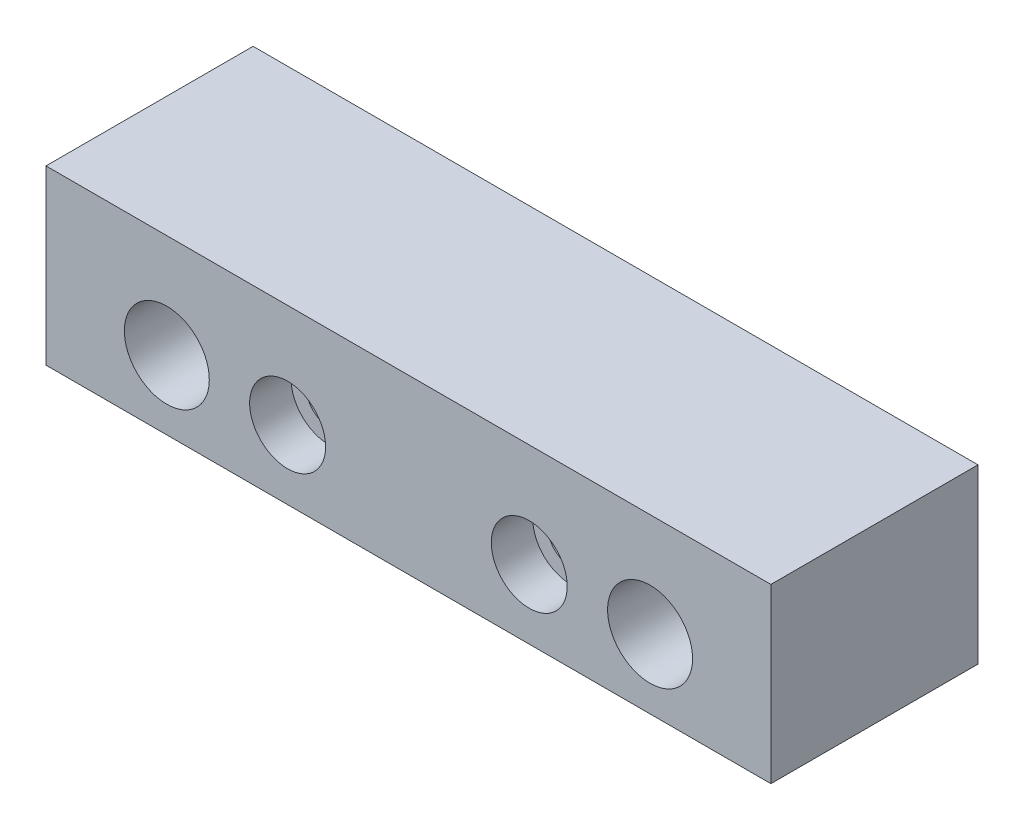
ISO-10303-21;
HEADER;
FILE_DESCRIPTION(('STEP AP214'),'2;1');
FILE_NAME('part.step','',(''),(''),'','','');
FILE_SCHEMA(('AUTOMOTIVE_DESIGN { 1 0 10303 214 1 1 1 1 }'));
ENDSEC;
DATA;
#1=APPLICATION_CONTEXT('core data for automotive mechanical design processes');
#2=APPLICATION_PROTOCOL_DEFINITION('international standard','automotive_design',2000,#1);
#3=PRODUCT_CONTEXT('',#1,'mechanical');
#4=PRODUCT('Part','Part','',(#3));
#5=PRODUCT_RELATED_PRODUCT_CATEGORY('part','',(#4));
#6=PRODUCT_DEFINITION_FORMATION('','',#4);
#7=PRODUCT_DEFINITION_CONTEXT('part definition',#1,'design');
#8=PRODUCT_DEFINITION('design','',#6,#7);
#9=PRODUCT_DEFINITION_SHAPE('','',#8);
#10=(LENGTH_UNIT() NAMED_UNIT(*) SI_UNIT(.MILLI.,.METRE.));
#11=(NAMED_UNIT(*) PLANE_ANGLE_UNIT() SI_UNIT($,.RADIAN.));
#12=(NAMED_UNIT(*) SI_UNIT($,.STERADIAN.) SOLID_ANGLE_UNIT());
#13=UNCERTAINTY_MEASURE_WITH_UNIT(LENGTH_MEASURE(1.E-05),#10,'distance_accuracy_value','');
#14=(GEOMETRIC_REPRESENTATION_CONTEXT(3) GLOBAL_UNCERTAINTY_ASSIGNED_CONTEXT((#13)) GLOBAL_UNIT_ASSIGNED_CONTEXT((#10,
#11,#12)) REPRESENTATION_CONTEXT('',''));
#15=CARTESIAN_POINT('',(0.,0.,0.));
#16=DIRECTION('',(0.,0.,1.));
#17=DIRECTION('',(1.,0.,0.));
#18=AXIS2_PLACEMENT_3D('',#15,#16,#17);
#19=CARTESIAN_POINT('',(-52.5,-12.5,30.));
#20=DIRECTION('',(1.,0.,0.));
#21=DIRECTION('',(0.,0.,-1.));
#22=AXIS2_PLACEMENT_3D('',#19,#20,#21);
#23=PLANE('',#22);
#24=DIRECTION('',(0.,-1.,0.));
#25=VECTOR('',#24,1.);
#26=CARTESIAN_POINT('',(-52.5,-12.5,0.));
#27=LINE('',#26,#25);
#28=CARTESIAN_POINT('',(-52.5,12.5,0.));
#29=VERTEX_POINT('',#28);
#30=CARTESIAN_POINT('',(-52.5,-12.5,0.));
#31=VERTEX_POINT('',#30);
#32=EDGE_CURVE('E83',#29,#31,#27,.T.);
#33=ORIENTED_EDGE('',*,*,#32,.T.);
#34=DIRECTION('',(0.,0.,-1.));
#35=VECTOR('',#34,1.);
#36=CARTESIAN_POINT('',(-52.5,-12.5,30.));
#37=LINE('',#36,#35);
#38=CARTESIAN_POINT('',(-52.5,-12.5,30.));
#39=VERTEX_POINT('',#38);
#40=EDGE_CURVE('E11',#39,#31,#37,.T.);
#41=ORIENTED_EDGE('',*,*,#40,.F.);
#42=DIRECTION('',(0.,-1.,0.));
#43=VECTOR('',#42,1.);
#44=CARTESIAN_POINT('',(-52.5,-12.5,30.));
#45=LINE('',#44,#43);
#46=CARTESIAN_POINT('',(-52.5,12.5,30.));
#47=VERTEX_POINT('',#46);
#48=EDGE_CURVE('E70',#47,#39,#45,.T.);
#49=ORIENTED_EDGE('',*,*,#48,.F.);
#50=DIRECTION('',(0.,0.,-1.));
#51=VECTOR('',#50,1.);
#52=CARTESIAN_POINT('',(-52.5,12.5,30.));
#53=LINE('',#52,#51);
#54=EDGE_CURVE('E79',#47,#29,#53,.T.);
#55=ORIENTED_EDGE('',*,*,#54,.T.);
#56=EDGE_LOOP('',(#33,#41,#49,#55));
#57=FACE_BOUND('',#56,.T.);
#58=ADVANCED_FACE('F17',(#57),#23,.F.);
#59=CARTESIAN_POINT('',(52.5,-12.5,30.));
#60=DIRECTION('',(0.,1.,0.));
#61=DIRECTION('',(-1.,0.,0.));
#62=AXIS2_PLACEMENT_3D('',#59,#60,#61);
#63=PLANE('',#62);
#64=DIRECTION('',(1.,0.,0.));
#65=VECTOR('',#64,1.);
#66=CARTESIAN_POINT('',(52.5,-12.5,0.));
#67=LINE('',#66,#65);
#68=CARTESIAN_POINT('',(52.5,-12.5,0.));
#69=VERTEX_POINT('',#68);
#70=EDGE_CURVE('E74',#31,#69,#67,.T.);
#71=ORIENTED_EDGE('',*,*,#70,.T.);
#72=DIRECTION('',(0.,0.,-1.));
#73=VECTOR('',#72,1.);
#74=CARTESIAN_POINT('',(52.5,-12.5,30.));
#75=LINE('',#74,#73);
#76=CARTESIAN_POINT('',(52.5,-12.5,30.));
#77=VERTEX_POINT('',#76);
#78=EDGE_CURVE('E26',#77,#69,#75,.T.);
#79=ORIENTED_EDGE('',*,*,#78,.F.);
#80=DIRECTION('',(1.,0.,0.));
#81=VECTOR('',#80,1.);
#82=CARTESIAN_POINT('',(52.5,-12.5,30.));
#83=LINE('',#82,#81);
#84=EDGE_CURVE('E65',#39,#77,#83,.T.);
#85=ORIENTED_EDGE('',*,*,#84,.F.);
#86=ORIENTED_EDGE('',*,*,#40,.T.);
#87=EDGE_LOOP('',(#71,#79,#85,#86));
#88=FACE_BOUND('',#87,.T.);
#89=ADVANCED_FACE('F73',(#88),#63,.F.);
#90=CARTESIAN_POINT('',(52.5,-12.5,30.));
#91=DIRECTION('',(-1.,0.,0.));
#92=DIRECTION('',(0.,0.,1.));
#93=AXIS2_PLACEMENT_3D('',#90,#91,#92);
#94=PLANE('',#93);
#95=DIRECTION('',(0.,1.,0.));
#96=VECTOR('',#95,1.);
#97=CARTESIAN_POINT('',(52.5,-12.5,0.));
#98=LINE('',#97,#96);
#99=CARTESIAN_POINT('',(52.5,12.5,0.));
#100=VERTEX_POINT('',#99);
#101=EDGE_CURVE('E52',#69,#100,#98,.T.);
#102=ORIENTED_EDGE('',*,*,#101,.T.);
#103=DIRECTION('',(0.,0.,-1.));
#104=VECTOR('',#103,1.);
#105=CARTESIAN_POINT('',(52.5,12.5,30.));
#106=LINE('',#105,#104);
#107=CARTESIAN_POINT('',(52.5,12.5,30.));
#108=VERTEX_POINT('',#107);
#109=EDGE_CURVE('E75',#108,#100,#106,.T.);
#110=ORIENTED_EDGE('',*,*,#109,.F.);
#111=DIRECTION('',(0.,1.,0.));
#112=VECTOR('',#111,1.);
#113=CARTESIAN_POINT('',(52.5,-12.5,30.));
#114=LINE('',#113,#112);
#115=EDGE_CURVE('E68',#77,#108,#114,.T.);
#116=ORIENTED_EDGE('',*,*,#115,.F.);
#117=ORIENTED_EDGE('',*,*,#78,.T.);
#118=EDGE_LOOP('',(#102,#110,#116,#117));
#119=FACE_BOUND('',#118,.T.);
#120=ADVANCED_FACE('F77',(#119),#94,.F.);
#121=CARTESIAN_POINT('',(52.5,12.5,30.));
#122=DIRECTION('',(0.,-1.,0.));
#123=DIRECTION('',(1.,0.,0.));
#124=AXIS2_PLACEMENT_3D('',#121,#122,#123);
#125=PLANE('',#124);
#126=DIRECTION('',(-1.,0.,0.));
#127=VECTOR('',#126,1.);
#128=CARTESIAN_POINT('',(52.5,12.5,0.));
#129=LINE('',#128,#127);
#130=EDGE_CURVE('E58',#100,#29,#129,.T.);
#131=ORIENTED_EDGE('',*,*,#130,.T.);
#132=ORIENTED_EDGE('',*,*,#54,.F.);
#133=DIRECTION('',(-1.,0.,0.));
#134=VECTOR('',#133,1.);
#135=CARTESIAN_POINT('',(52.5,12.5,30.));
#136=LINE('',#135,#134);
#137=EDGE_CURVE('E35',#108,#47,#136,.T.);
#138=ORIENTED_EDGE('',*,*,#137,.F.);
#139=ORIENTED_EDGE('',*,*,#109,.T.);
#140=EDGE_LOOP('',(#131,#132,#138,#139));
#141=FACE_BOUND('',#140,.T.);
#142=ADVANCED_FACE('F153',(#141),#125,.F.);
#143=CARTESIAN_POINT('',(-52.5,12.5,30.));
#144=DIRECTION('',(0.,0.,1.));
#145=DIRECTION('',(1.,0.,0.));
#146=AXIS2_PLACEMENT_3D('',#143,#144,#145);
#147=PLANE('',#146);
#148=CARTESIAN_POINT('',(-17.5,-2.5,30.));
#149=DIRECTION('',(0.,0.,1.));
#150=DIRECTION('',(1.,0.,0.));
#151=AXIS2_PLACEMENT_3D('',#148,#149,#150);
#152=CIRCLE('',#151,5.5);
#153=CARTESIAN_POINT('',(-12.,-2.5,30.));
#154=VERTEX_POINT('',#153);
#155=EDGE_CURVE('E398',#154,#154,#152,.T.);
#156=ORIENTED_EDGE('',*,*,#155,.F.);
#157=EDGE_LOOP('',(#156));
#158=FACE_BOUND('',#157,.T.);
#159=CARTESIAN_POINT('',(17.5,-2.5,30.));
#160=DIRECTION('',(0.,0.,1.));
#161=DIRECTION('',(1.,0.,0.));
#162=AXIS2_PLACEMENT_3D('',#159,#160,#161);
#163=CIRCLE('',#162,5.5);
#164=CARTESIAN_POINT('',(23.,-2.5,30.));
#165=VERTEX_POINT('',#164);
#166=EDGE_CURVE('E408',#165,#165,#163,.T.);
#167=ORIENTED_EDGE('',*,*,#166,.F.);
#168=EDGE_LOOP('',(#167));
#169=FACE_BOUND('',#168,.T.);
#170=CARTESIAN_POINT('',(-35.,-2.5,30.));
#171=DIRECTION('',(0.,0.,1.));
#172=DIRECTION('',(1.,0.,0.));
#173=AXIS2_PLACEMENT_3D('',#170,#171,#172);
#174=CIRCLE('',#173,6.154);
#175=CARTESIAN_POINT('',(-28.846,-2.5,30.));
#176=VERTEX_POINT('',#175);
#177=EDGE_CURVE('E93',#176,#176,#174,.T.);
#178=ORIENTED_EDGE('',*,*,#177,.F.);
#179=EDGE_LOOP('',(#178));
#180=FACE_BOUND('',#179,.T.);
#181=CARTESIAN_POINT('',(35.,-2.5,30.));
#182=DIRECTION('',(0.,0.,1.));
#183=DIRECTION('',(1.,0.,0.));
#184=AXIS2_PLACEMENT_3D('',#181,#182,#183);
#185=CIRCLE('',#184,6.154);
#186=CARTESIAN_POINT('',(41.154,-2.5,30.));
#187=VERTEX_POINT('',#186);
#188=EDGE_CURVE('E118',#187,#187,#185,.T.);
#189=ORIENTED_EDGE('',*,*,#188,.F.);
#190=EDGE_LOOP('',(#189));
#191=FACE_BOUND('',#190,.T.);
#192=ORIENTED_EDGE('',*,*,#48,.T.);
#193=ORIENTED_EDGE('',*,*,#84,.T.);
#194=ORIENTED_EDGE('',*,*,#115,.T.);
#195=ORIENTED_EDGE('',*,*,#137,.T.);
#196=EDGE_LOOP('',(#192,#193,#194,#195));
#197=FACE_BOUND('',#196,.T.);
#198=ADVANCED_FACE('F66',(#158,#169,#180,#191,#197),#147,.T.);
#199=CARTESIAN_POINT('',(-52.5,12.5,0.));
#200=DIRECTION('',(0.,0.,1.));
#201=DIRECTION('',(1.,0.,0.));
#202=AXIS2_PLACEMENT_3D('',#199,#200,#201);
#203=PLANE('',#202);
#204=CARTESIAN_POINT('',(-17.5,-2.5,0.));
#205=DIRECTION('',(0.,0.,1.));
#206=DIRECTION('',(1.,0.,0.));
#207=AXIS2_PLACEMENT_3D('',#204,#205,#206);
#208=CIRCLE('',#207,3.3);
#209=CARTESIAN_POINT('',(-14.2,-2.5,0.));
#210=VERTEX_POINT('',#209);
#211=EDGE_CURVE('E405',#210,#210,#208,.T.);
#212=ORIENTED_EDGE('',*,*,#211,.T.);
#213=EDGE_LOOP('',(#212));
#214=FACE_BOUND('',#213,.T.);
#215=CARTESIAN_POINT('',(17.5,-2.5,0.));
#216=DIRECTION('',(0.,0.,1.));
#217=DIRECTION('',(1.,0.,0.));
#218=AXIS2_PLACEMENT_3D('',#215,#216,#217);
#219=CIRCLE('',#218,3.3);
#220=CARTESIAN_POINT('',(20.8,-2.5,0.));
#221=VERTEX_POINT('',#220);
#222=EDGE_CURVE('E417',#221,#221,#219,.T.);
#223=ORIENTED_EDGE('',*,*,#222,.T.);
#224=EDGE_LOOP('',(#223));
#225=FACE_BOUND('',#224,.T.);
#226=CARTESIAN_POINT('',(-35.,-2.5,0.));
#227=DIRECTION('',(0.,0.,-1.));
#228=DIRECTION('',(-1.,0.,0.));
#229=AXIS2_PLACEMENT_3D('',#226,#227,#228);
#230=CIRCLE('',#229,5.);
#231=CARTESIAN_POINT('',(-40.,-2.5,0.));
#232=VERTEX_POINT('',#231);
#233=EDGE_CURVE('E420',#232,#232,#230,.T.);
#234=ORIENTED_EDGE('',*,*,#233,.F.);
#235=EDGE_LOOP('',(#234));
#236=FACE_BOUND('',#235,.T.);
#237=CARTESIAN_POINT('',(35.,-2.5,0.));
#238=DIRECTION('',(0.,0.,-1.));
#239=DIRECTION('',(-1.,0.,0.));
#240=AXIS2_PLACEMENT_3D('',#237,#238,#239);
#241=CIRCLE('',#240,5.);
#242=CARTESIAN_POINT('',(30.,-2.5,0.));
#243=VERTEX_POINT('',#242);
#244=EDGE_CURVE('E106',#243,#243,#241,.T.);
#245=ORIENTED_EDGE('',*,*,#244,.F.);
#246=EDGE_LOOP('',(#245));
#247=FACE_BOUND('',#246,.T.);
#248=ORIENTED_EDGE('',*,*,#32,.F.);
#249=ORIENTED_EDGE('',*,*,#130,.F.);
#250=ORIENTED_EDGE('',*,*,#101,.F.);
#251=ORIENTED_EDGE('',*,*,#70,.F.);
#252=EDGE_LOOP('',(#248,#249,#250,#251));
#253=FACE_BOUND('',#252,.T.);
#254=ADVANCED_FACE('F152',(#214,#225,#236,#247,#253),#203,.F.);
#255=CARTESIAN_POINT('',(35.,-2.5,14.));
#256=DIRECTION('',(0.,0.,1.));
#257=DIRECTION('',(1.,0.,0.));
#258=AXIS2_PLACEMENT_3D('',#255,#256,#257);
#259=CONICAL_SURFACE('',#258,5.35,1.02974425867665);
#260=CARTESIAN_POINT('',(35.,-2.5,12.2875472357715));
#261=DIRECTION('',(0.,0.,1.));
#262=DIRECTION('',(1.,0.,0.));
#263=AXIS2_PLACEMENT_3D('',#260,#261,#262);
#264=CIRCLE('',#263,2.5);
#265=CARTESIAN_POINT('',(37.5,-2.5,12.2875472357715));
#266=VERTEX_POINT('',#265);
#267=EDGE_CURVE('E91',#266,#266,#264,.F.);
#268=ORIENTED_EDGE('',*,*,#267,.T.);
#269=EDGE_LOOP('',(#268));
#270=FACE_BOUND('',#269,.T.);
#271=CARTESIAN_POINT('',(35.,-2.5,14.));
#272=DIRECTION('',(0.,0.,1.));
#273=DIRECTION('',(1.,0.,0.));
#274=AXIS2_PLACEMENT_3D('',#271,#272,#273);
#275=CIRCLE('',#274,5.35);
#276=CARTESIAN_POINT('',(40.35,-2.5,14.));
#277=VERTEX_POINT('',#276);
#278=EDGE_CURVE('E86',#277,#277,#275,.T.);
#279=ORIENTED_EDGE('',*,*,#278,.T.);
#280=EDGE_LOOP('',(#279));
#281=FACE_BOUND('',#280,.T.);
#282=ADVANCED_FACE('F130',(#270,#281),#259,.F.);
#283=CARTESIAN_POINT('',(35.,-2.5,30.));
#284=DIRECTION('',(0.,0.,1.));
#285=DIRECTION('',(1.,0.,0.));
#286=AXIS2_PLACEMENT_3D('',#283,#284,#285);
#287=CYLINDRICAL_SURFACE('',#286,5.35);
#288=ORIENTED_EDGE('',*,*,#278,.F.);
#289=EDGE_LOOP('',(#288));
#290=FACE_BOUND('',#289,.T.);
#291=CARTESIAN_POINT('',(35.,-2.5,19.));
#292=DIRECTION('',(0.,0.,1.));
#293=DIRECTION('',(1.,0.,0.));
#294=AXIS2_PLACEMENT_3D('',#291,#292,#293);
#295=CIRCLE('',#294,5.35);
#296=CARTESIAN_POINT('',(40.35,-2.5,19.));
#297=VERTEX_POINT('',#296);
#298=EDGE_CURVE('E124',#297,#297,#295,.T.);
#299=ORIENTED_EDGE('',*,*,#298,.T.);
#300=EDGE_LOOP('',(#299));
#301=FACE_BOUND('',#300,.T.);
#302=ADVANCED_FACE('F132',(#290,#301),#287,.F.);
#303=CARTESIAN_POINT('',(40.35,-2.5,19.));
#304=DIRECTION('',(0.,0.,-1.));
#305=DIRECTION('',(-1.,0.,0.));
#306=AXIS2_PLACEMENT_3D('',#303,#304,#305);
#307=PLANE('',#306);
#308=ORIENTED_EDGE('',*,*,#298,.F.);
#309=EDGE_LOOP('',(#308));
#310=FACE_BOUND('',#309,.T.);
#311=CARTESIAN_POINT('',(35.,-2.5,19.));
#312=DIRECTION('',(0.,0.,1.));
#313=DIRECTION('',(1.,0.,0.));
#314=AXIS2_PLACEMENT_3D('',#311,#312,#313);
#315=CIRCLE('',#314,5.81061716828156);
#316=CARTESIAN_POINT('',(40.8106171682816,-2.5,19.));
#317=VERTEX_POINT('',#316);
#318=EDGE_CURVE('E121',#317,#317,#315,.T.);
#319=ORIENTED_EDGE('',*,*,#318,.T.);
#320=EDGE_LOOP('',(#319));
#321=FACE_BOUND('',#320,.T.);
#322=ADVANCED_FACE('F135',(#310,#321),#307,.F.);
#323=CARTESIAN_POINT('',(35.,-2.5,30.));
#324=DIRECTION('',(0.,0.,1.));
#325=DIRECTION('',(1.,0.,0.));
#326=AXIS2_PLACEMENT_3D('',#323,#324,#325);
#327=CONICAL_SURFACE('',#326,6.154,0.0312064870256583);
#328=ORIENTED_EDGE('',*,*,#318,.F.);
#329=EDGE_LOOP('',(#328));
#330=FACE_BOUND('',#329,.T.);
#331=ORIENTED_EDGE('',*,*,#188,.T.);
#332=EDGE_LOOP('',(#331));
#333=FACE_BOUND('',#332,.T.);
#334=ADVANCED_FACE('F141',(#330,#333),#327,.F.);
#335=CARTESIAN_POINT('',(-35.,-2.5,14.));
#336=DIRECTION('',(0.,0.,1.));
#337=DIRECTION('',(1.,0.,0.));
#338=AXIS2_PLACEMENT_3D('',#335,#336,#337);
#339=CONICAL_SURFACE('',#338,5.35,1.02974425867665);
#340=CARTESIAN_POINT('',(-35.,-2.5,12.2875472357715));
#341=DIRECTION('',(0.,0.,1.));
#342=DIRECTION('',(1.,0.,0.));
#343=AXIS2_PLACEMENT_3D('',#340,#341,#342);
#344=CIRCLE('',#343,2.5);
#345=CARTESIAN_POINT('',(-32.5,-2.5,12.2875472357715));
#346=VERTEX_POINT('',#345);
#347=EDGE_CURVE('E20',#346,#346,#344,.F.);
#348=ORIENTED_EDGE('',*,*,#347,.T.);
#349=EDGE_LOOP('',(#348));
#350=FACE_BOUND('',#349,.T.);
#351=CARTESIAN_POINT('',(-35.,-2.5,14.));
#352=DIRECTION('',(0.,0.,1.));
#353=DIRECTION('',(1.,0.,0.));
#354=AXIS2_PLACEMENT_3D('',#351,#352,#353);
#355=CIRCLE('',#354,5.35);
#356=CARTESIAN_POINT('',(-29.65,-2.5,14.));
#357=VERTEX_POINT('',#356);
#358=EDGE_CURVE('E115',#357,#357,#355,.T.);
#359=ORIENTED_EDGE('',*,*,#358,.T.);
#360=EDGE_LOOP('',(#359));
#361=FACE_BOUND('',#360,.T.);
#362=ADVANCED_FACE('F147',(#350,#361),#339,.F.);
#363=CARTESIAN_POINT('',(-35.,-2.5,30.));
#364=DIRECTION('',(0.,0.,1.));
#365=DIRECTION('',(1.,0.,0.));
#366=AXIS2_PLACEMENT_3D('',#363,#364,#365);
#367=CYLINDRICAL_SURFACE('',#366,5.35);
#368=ORIENTED_EDGE('',*,*,#358,.F.);
#369=EDGE_LOOP('',(#368));
#370=FACE_BOUND('',#369,.T.);
#371=CARTESIAN_POINT('',(-35.,-2.5,19.));
#372=DIRECTION('',(0.,0.,1.));
#373=DIRECTION('',(1.,0.,0.));
#374=AXIS2_PLACEMENT_3D('',#371,#372,#373);
#375=CIRCLE('',#374,5.35);
#376=CARTESIAN_POINT('',(-29.65,-2.5,19.));
#377=VERTEX_POINT('',#376);
#378=EDGE_CURVE('E112',#377,#377,#375,.T.);
#379=ORIENTED_EDGE('',*,*,#378,.T.);
#380=EDGE_LOOP('',(#379));
#381=FACE_BOUND('',#380,.T.);
#382=ADVANCED_FACE('F238',(#370,#381),#367,.F.);
#383=CARTESIAN_POINT('',(-29.65,-2.5,19.));
#384=DIRECTION('',(0.,0.,-1.));
#385=DIRECTION('',(-1.,0.,0.));
#386=AXIS2_PLACEMENT_3D('',#383,#384,#385);
#387=PLANE('',#386);
#388=ORIENTED_EDGE('',*,*,#378,.F.);
#389=EDGE_LOOP('',(#388));
#390=FACE_BOUND('',#389,.T.);
#391=CARTESIAN_POINT('',(-35.,-2.5,19.));
#392=DIRECTION('',(0.,0.,1.));
#393=DIRECTION('',(1.,0.,0.));
#394=AXIS2_PLACEMENT_3D('',#391,#392,#393);
#395=CIRCLE('',#394,5.81061716828156);
#396=CARTESIAN_POINT('',(-29.1893828317184,-2.5,19.));
#397=VERTEX_POINT('',#396);
#398=EDGE_CURVE('E98',#397,#397,#395,.T.);
#399=ORIENTED_EDGE('',*,*,#398,.T.);
#400=EDGE_LOOP('',(#399));
#401=FACE_BOUND('',#400,.T.);
#402=ADVANCED_FACE('F249',(#390,#401),#387,.F.);
#403=CARTESIAN_POINT('',(-35.,-2.5,30.));
#404=DIRECTION('',(0.,0.,1.));
#405=DIRECTION('',(1.,0.,0.));
#406=AXIS2_PLACEMENT_3D('',#403,#404,#405);
#407=CONICAL_SURFACE('',#406,6.154,0.0312064870256586);
#408=ORIENTED_EDGE('',*,*,#398,.F.);
#409=EDGE_LOOP('',(#408));
#410=FACE_BOUND('',#409,.T.);
#411=ORIENTED_EDGE('',*,*,#177,.T.);
#412=EDGE_LOOP('',(#411));
#413=FACE_BOUND('',#412,.T.);
#414=ADVANCED_FACE('F259',(#410,#413),#407,.F.);
#415=CARTESIAN_POINT('',(35.,-2.5,0.));
#416=DIRECTION('',(0.,0.,-1.));
#417=DIRECTION('',(-1.,0.,0.));
#418=AXIS2_PLACEMENT_3D('',#415,#416,#417);
#419=CYLINDRICAL_SURFACE('',#418,2.5);
#420=CARTESIAN_POINT('',(35.,-2.5,1.4));
#421=DIRECTION('',(0.,0.,-1.));
#422=DIRECTION('',(-1.,0.,0.));
#423=AXIS2_PLACEMENT_3D('',#420,#421,#422);
#424=CIRCLE('',#423,2.5);
#425=CARTESIAN_POINT('',(32.5,-2.5,1.4));
#426=VERTEX_POINT('',#425);
#427=EDGE_CURVE('E94',#426,#426,#424,.T.);
#428=ORIENTED_EDGE('',*,*,#427,.T.);
#429=EDGE_LOOP('',(#428));
#430=FACE_BOUND('',#429,.T.);
#431=ORIENTED_EDGE('',*,*,#267,.F.);
#432=EDGE_LOOP('',(#431));
#433=FACE_BOUND('',#432,.T.);
#434=ADVANCED_FACE('F268',(#430,#433),#419,.F.);
#435=CARTESIAN_POINT('',(37.5,-2.5,1.4));
#436=DIRECTION('',(0.,0.,1.));
#437=DIRECTION('',(1.,0.,0.));
#438=AXIS2_PLACEMENT_3D('',#435,#436,#437);
#439=PLANE('',#438);
#440=ORIENTED_EDGE('',*,*,#427,.F.);
#441=EDGE_LOOP('',(#440));
#442=FACE_BOUND('',#441,.T.);
#443=CARTESIAN_POINT('',(35.,-2.5,1.4));
#444=DIRECTION('',(0.,0.,-1.));
#445=DIRECTION('',(-1.,0.,0.));
#446=AXIS2_PLACEMENT_3D('',#443,#444,#445);
#447=CIRCLE('',#446,5.);
#448=CARTESIAN_POINT('',(30.,-2.5,1.4));
#449=VERTEX_POINT('',#448);
#450=EDGE_CURVE('E101',#449,#449,#447,.T.);
#451=ORIENTED_EDGE('',*,*,#450,.T.);
#452=EDGE_LOOP('',(#451));
#453=FACE_BOUND('',#452,.T.);
#454=ADVANCED_FACE('F277',(#442,#453),#439,.F.);
#455=CARTESIAN_POINT('',(35.,-2.5,0.));
#456=DIRECTION('',(0.,0.,-1.));
#457=DIRECTION('',(-1.,0.,0.));
#458=AXIS2_PLACEMENT_3D('',#455,#456,#457);
#459=CYLINDRICAL_SURFACE('',#458,5.);
#460=ORIENTED_EDGE('',*,*,#450,.F.);
#461=EDGE_LOOP('',(#460));
#462=FACE_BOUND('',#461,.T.);
#463=ORIENTED_EDGE('',*,*,#244,.T.);
#464=EDGE_LOOP('',(#463));
#465=FACE_BOUND('',#464,.T.);
#466=ADVANCED_FACE('F286',(#462,#465),#459,.F.);
#467=CARTESIAN_POINT('',(-35.,-2.5,0.));
#468=DIRECTION('',(0.,0.,-1.));
#469=DIRECTION('',(-1.,0.,0.));
#470=AXIS2_PLACEMENT_3D('',#467,#468,#469);
#471=CYLINDRICAL_SURFACE('',#470,2.5);
#472=CARTESIAN_POINT('',(-35.,-2.5,1.4));
#473=DIRECTION('',(0.,0.,-1.));
#474=DIRECTION('',(-1.,0.,0.));
#475=AXIS2_PLACEMENT_3D('',#472,#473,#474);
#476=CIRCLE('',#475,2.5);
#477=CARTESIAN_POINT('',(-37.5,-2.5,1.4));
#478=VERTEX_POINT('',#477);
#479=EDGE_CURVE('E426',#478,#478,#476,.T.);
#480=ORIENTED_EDGE('',*,*,#479,.T.);
#481=EDGE_LOOP('',(#480));
#482=FACE_BOUND('',#481,.T.);
#483=ORIENTED_EDGE('',*,*,#347,.F.);
#484=EDGE_LOOP('',(#483));
#485=FACE_BOUND('',#484,.T.);
#486=ADVANCED_FACE('F297',(#482,#485),#471,.F.);
#487=CARTESIAN_POINT('',(-32.5,-2.5,1.4));
#488=DIRECTION('',(0.,0.,1.));
#489=DIRECTION('',(1.,0.,0.));
#490=AXIS2_PLACEMENT_3D('',#487,#488,#489);
#491=PLANE('',#490);
#492=ORIENTED_EDGE('',*,*,#479,.F.);
#493=EDGE_LOOP('',(#492));
#494=FACE_BOUND('',#493,.T.);
#495=CARTESIAN_POINT('',(-35.,-2.5,1.4));
#496=DIRECTION('',(0.,0.,-1.));
#497=DIRECTION('',(-1.,0.,0.));
#498=AXIS2_PLACEMENT_3D('',#495,#496,#497);
#499=CIRCLE('',#498,5.);
#500=CARTESIAN_POINT('',(-40.,-2.5,1.4));
#501=VERTEX_POINT('',#500);
#502=EDGE_CURVE('E423',#501,#501,#499,.T.);
#503=ORIENTED_EDGE('',*,*,#502,.T.);
#504=EDGE_LOOP('',(#503));
#505=FACE_BOUND('',#504,.T.);
#506=ADVANCED_FACE('F309',(#494,#505),#491,.F.);
#507=CARTESIAN_POINT('',(-35.,-2.5,0.));
#508=DIRECTION('',(0.,0.,-1.));
#509=DIRECTION('',(-1.,0.,0.));
#510=AXIS2_PLACEMENT_3D('',#507,#508,#509);
#511=CYLINDRICAL_SURFACE('',#510,5.);
#512=ORIENTED_EDGE('',*,*,#502,.F.);
#513=EDGE_LOOP('',(#512));
#514=FACE_BOUND('',#513,.T.);
#515=ORIENTED_EDGE('',*,*,#233,.T.);
#516=EDGE_LOOP('',(#515));
#517=FACE_BOUND('',#516,.T.);
#518=ADVANCED_FACE('F318',(#514,#517),#511,.F.);
#519=CARTESIAN_POINT('',(17.5,-2.5,30.));
#520=DIRECTION('',(0.,0.,1.));
#521=DIRECTION('',(1.,0.,0.));
#522=AXIS2_PLACEMENT_3D('',#519,#520,#521);
#523=CYLINDRICAL_SURFACE('',#522,3.3);
#524=ORIENTED_EDGE('',*,*,#222,.F.);
#525=EDGE_LOOP('',(#524));
#526=FACE_BOUND('',#525,.T.);
#527=CARTESIAN_POINT('',(17.5,-2.5,24.));
#528=DIRECTION('',(0.,0.,1.));
#529=DIRECTION('',(1.,0.,0.));
#530=AXIS2_PLACEMENT_3D('',#527,#528,#529);
#531=CIRCLE('',#530,3.3);
#532=CARTESIAN_POINT('',(20.8,-2.5,24.));
#533=VERTEX_POINT('',#532);
#534=EDGE_CURVE('E414',#533,#533,#531,.T.);
#535=ORIENTED_EDGE('',*,*,#534,.T.);
#536=EDGE_LOOP('',(#535));
#537=FACE_BOUND('',#536,.T.);
#538=ADVANCED_FACE('F327',(#526,#537),#523,.F.);
#539=CARTESIAN_POINT('',(20.8,-2.5,24.));
#540=DIRECTION('',(0.,0.,-1.));
#541=DIRECTION('',(-1.,0.,0.));
#542=AXIS2_PLACEMENT_3D('',#539,#540,#541);
#543=PLANE('',#542);
#544=ORIENTED_EDGE('',*,*,#534,.F.);
#545=EDGE_LOOP('',(#544));
#546=FACE_BOUND('',#545,.T.);
#547=CARTESIAN_POINT('',(17.5,-2.5,24.));
#548=DIRECTION('',(0.,0.,1.));
#549=DIRECTION('',(1.,0.,0.));
#550=AXIS2_PLACEMENT_3D('',#547,#548,#549);
#551=CIRCLE('',#550,5.5);
#552=CARTESIAN_POINT('',(23.,-2.5,24.));
#553=VERTEX_POINT('',#552);
#554=EDGE_CURVE('E411',#553,#553,#551,.T.);
#555=ORIENTED_EDGE('',*,*,#554,.T.);
#556=EDGE_LOOP('',(#555));
#557=FACE_BOUND('',#556,.T.);
#558=ADVANCED_FACE('F338',(#546,#557),#543,.F.);
#559=CARTESIAN_POINT('',(17.5,-2.5,30.));
#560=DIRECTION('',(0.,0.,1.));
#561=DIRECTION('',(1.,0.,0.));
#562=AXIS2_PLACEMENT_3D('',#559,#560,#561);
#563=CYLINDRICAL_SURFACE('',#562,5.5);
#564=ORIENTED_EDGE('',*,*,#554,.F.);
#565=EDGE_LOOP('',(#564));
#566=FACE_BOUND('',#565,.T.);
#567=ORIENTED_EDGE('',*,*,#166,.T.);
#568=EDGE_LOOP('',(#567));
#569=FACE_BOUND('',#568,.T.);
#570=ADVANCED_FACE('F348',(#566,#569),#563,.F.);
#571=CARTESIAN_POINT('',(-17.5,-2.5,30.));
#572=DIRECTION('',(0.,0.,1.));
#573=DIRECTION('',(1.,0.,0.));
#574=AXIS2_PLACEMENT_3D('',#571,#572,#573);
#575=CYLINDRICAL_SURFACE('',#574,3.3);
#576=ORIENTED_EDGE('',*,*,#211,.F.);
#577=EDGE_LOOP('',(#576));
#578=FACE_BOUND('',#577,.T.);
#579=CARTESIAN_POINT('',(-17.5,-2.5,24.));
#580=DIRECTION('',(0.,0.,1.));
#581=DIRECTION('',(1.,0.,0.));
#582=AXIS2_PLACEMENT_3D('',#579,#580,#581);
#583=CIRCLE('',#582,3.3);
#584=CARTESIAN_POINT('',(-14.2,-2.5,24.));
#585=VERTEX_POINT('',#584);
#586=EDGE_CURVE('E400',#585,#585,#583,.T.);
#587=ORIENTED_EDGE('',*,*,#586,.T.);
#588=EDGE_LOOP('',(#587));
#589=FACE_BOUND('',#588,.T.);
#590=ADVANCED_FACE('F358',(#578,#589),#575,.F.);
#591=CARTESIAN_POINT('',(-14.2,-2.5,24.));
#592=DIRECTION('',(0.,0.,-1.));
#593=DIRECTION('',(-1.,0.,0.));
#594=AXIS2_PLACEMENT_3D('',#591,#592,#593);
#595=PLANE('',#594);
#596=ORIENTED_EDGE('',*,*,#586,.F.);
#597=EDGE_LOOP('',(#596));
#598=FACE_BOUND('',#597,.T.);
#599=CARTESIAN_POINT('',(-17.5,-2.5,24.));
#600=DIRECTION('',(0.,0.,1.));
#601=DIRECTION('',(1.,0.,0.));
#602=AXIS2_PLACEMENT_3D('',#599,#600,#601);
#603=CIRCLE('',#602,5.5);
#604=CARTESIAN_POINT('',(-12.,-2.5,24.));
#605=VERTEX_POINT('',#604);
#606=EDGE_CURVE('E396',#605,#605,#603,.T.);
#607=ORIENTED_EDGE('',*,*,#606,.T.);
#608=EDGE_LOOP('',(#607));
#609=FACE_BOUND('',#608,.T.);
#610=ADVANCED_FACE('F368',(#598,#609),#595,.F.);
#611=CARTESIAN_POINT('',(-17.5,-2.5,30.));
#612=DIRECTION('',(0.,0.,1.));
#613=DIRECTION('',(1.,0.,0.));
#614=AXIS2_PLACEMENT_3D('',#611,#612,#613);
#615=CYLINDRICAL_SURFACE('',#614,5.5);
#616=ORIENTED_EDGE('',*,*,#606,.F.);
#617=EDGE_LOOP('',(#616));
#618=FACE_BOUND('',#617,.T.);
#619=ORIENTED_EDGE('',*,*,#155,.T.);
#620=EDGE_LOOP('',(#619));
#621=FACE_BOUND('',#620,.T.);
#622=ADVANCED_FACE('F378',(#618,#621),#615,.F.);
#623=CLOSED_SHELL('',(#58,#89,#120,#142,#198,#254,#282,#302,#322,#334,#362,#382,#402,#414,#434,
#454,#466,#486,#506,#518,#538,#558,#570,#590,#610,#622));
#624=MANIFOLD_SOLID_BREP('B1',#623);
#625=ADVANCED_BREP_SHAPE_REPRESENTATION('',(#18,#624),#14);
#626=SHAPE_DEFINITION_REPRESENTATION(#9,#625);
ENDSEC;
END-ISO-10303-21;
